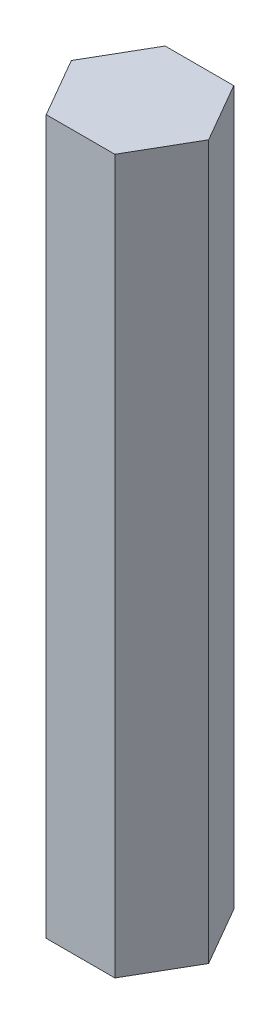
ISO-10303-21;
HEADER;
FILE_DESCRIPTION(('STEP AP214'),'2;1');
FILE_NAME('part.step','',(''),(''),'','','');
FILE_SCHEMA(('AUTOMOTIVE_DESIGN { 1 0 10303 214 1 1 1 1 }'));
ENDSEC;
DATA;
#1=APPLICATION_CONTEXT('core data for automotive mechanical design processes');
#2=APPLICATION_PROTOCOL_DEFINITION('international standard','automotive_design',2000,#1);
#3=PRODUCT_CONTEXT('',#1,'mechanical');
#4=PRODUCT('Part','Part','',(#3));
#5=PRODUCT_RELATED_PRODUCT_CATEGORY('part','',(#4));
#6=PRODUCT_DEFINITION_FORMATION('','',#4);
#7=PRODUCT_DEFINITION_CONTEXT('part definition',#1,'design');
#8=PRODUCT_DEFINITION('design','',#6,#7);
#9=PRODUCT_DEFINITION_SHAPE('','',#8);
#10=(LENGTH_UNIT() NAMED_UNIT(*) SI_UNIT(.MILLI.,.METRE.));
#11=(NAMED_UNIT(*) PLANE_ANGLE_UNIT() SI_UNIT($,.RADIAN.));
#12=(NAMED_UNIT(*) SI_UNIT($,.STERADIAN.) SOLID_ANGLE_UNIT());
#13=UNCERTAINTY_MEASURE_WITH_UNIT(LENGTH_MEASURE(1.E-05),#10,'distance_accuracy_value','');
#14=(GEOMETRIC_REPRESENTATION_CONTEXT(3) GLOBAL_UNCERTAINTY_ASSIGNED_CONTEXT((#13)) GLOBAL_UNIT_ASSIGNED_CONTEXT((#10,
#11,#12)) REPRESENTATION_CONTEXT('',''));
#15=CARTESIAN_POINT('',(0.,0.,0.));
#16=DIRECTION('',(0.,0.,1.));
#17=DIRECTION('',(1.,0.,0.));
#18=AXIS2_PLACEMENT_3D('',#15,#16,#17);
#19=CARTESIAN_POINT('',(7.33234841870825,38.1,0.));
#20=DIRECTION('',(-0.866025403784438,0.,0.5));
#21=DIRECTION('',(0.5,0.,0.866025403784438));
#22=AXIS2_PLACEMENT_3D('',#19,#20,#21);
#23=PLANE('',#22);
#24=DIRECTION('',(-0.5,0.,-0.866025403784438));
#25=VECTOR('',#24,1.);
#26=CARTESIAN_POINT('',(7.33234841870825,-38.1,0.));
#27=LINE('',#26,#25);
#28=CARTESIAN_POINT('',(7.33234841870825,-38.1,0.));
#29=VERTEX_POINT('',#28);
#30=CARTESIAN_POINT('',(3.66617420935413,-38.1,-6.35));
#31=VERTEX_POINT('',#30);
#32=EDGE_CURVE('E117',#29,#31,#27,.T.);
#33=ORIENTED_EDGE('',*,*,#32,.T.);
#34=DIRECTION('',(0.,-1.,0.));
#35=VECTOR('',#34,1.);
#36=CARTESIAN_POINT('',(3.66617420935413,38.1,-6.35));
#37=LINE('',#36,#35);
#38=CARTESIAN_POINT('',(3.66617420935413,38.1,-6.35));
#39=VERTEX_POINT('',#38);
#40=EDGE_CURVE('E11',#39,#31,#37,.T.);
#41=ORIENTED_EDGE('',*,*,#40,.F.);
#42=DIRECTION('',(-0.5,0.,-0.866025403784438));
#43=VECTOR('',#42,1.);
#44=CARTESIAN_POINT('',(7.33234841870825,38.1,0.));
#45=LINE('',#44,#43);
#46=CARTESIAN_POINT('',(7.33234841870825,38.1,0.));
#47=VERTEX_POINT('',#46);
#48=EDGE_CURVE('E127',#47,#39,#45,.T.);
#49=ORIENTED_EDGE('',*,*,#48,.F.);
#50=DIRECTION('',(0.,-1.,0.));
#51=VECTOR('',#50,1.);
#52=CARTESIAN_POINT('',(7.33234841870825,38.1,0.));
#53=LINE('',#52,#51);
#54=EDGE_CURVE('E113',#47,#29,#53,.T.);
#55=ORIENTED_EDGE('',*,*,#54,.T.);
#56=EDGE_LOOP('',(#33,#41,#49,#55));
#57=FACE_BOUND('',#56,.T.);
#58=ADVANCED_FACE('F33',(#57),#23,.F.);
#59=CARTESIAN_POINT('',(3.66617420935413,38.1,-6.35));
#60=DIRECTION('',(0.,0.,1.));
#61=DIRECTION('',(1.,0.,0.));
#62=AXIS2_PLACEMENT_3D('',#59,#60,#61);
#63=PLANE('',#62);
#64=DIRECTION('',(-1.,0.,0.));
#65=VECTOR('',#64,1.);
#66=CARTESIAN_POINT('',(3.66617420935413,-38.1,-6.35));
#67=LINE('',#66,#65);
#68=CARTESIAN_POINT('',(-3.66617420935412,-38.1,-6.35));
#69=VERTEX_POINT('',#68);
#70=EDGE_CURVE('E120',#31,#69,#67,.T.);
#71=ORIENTED_EDGE('',*,*,#70,.T.);
#72=DIRECTION('',(0.,-1.,0.));
#73=VECTOR('',#72,1.);
#74=CARTESIAN_POINT('',(-3.66617420935412,38.1,-6.35));
#75=LINE('',#74,#73);
#76=CARTESIAN_POINT('',(-3.66617420935412,38.1,-6.35));
#77=VERTEX_POINT('',#76);
#78=EDGE_CURVE('E41',#77,#69,#75,.T.);
#79=ORIENTED_EDGE('',*,*,#78,.F.);
#80=DIRECTION('',(-1.,0.,0.));
#81=VECTOR('',#80,1.);
#82=CARTESIAN_POINT('',(3.66617420935413,38.1,-6.35));
#83=LINE('',#82,#81);
#84=EDGE_CURVE('E86',#39,#77,#83,.T.);
#85=ORIENTED_EDGE('',*,*,#84,.F.);
#86=ORIENTED_EDGE('',*,*,#40,.T.);
#87=EDGE_LOOP('',(#71,#79,#85,#86));
#88=FACE_BOUND('',#87,.T.);
#89=ADVANCED_FACE('F151',(#88),#63,.F.);
#90=CARTESIAN_POINT('',(-3.66617420935412,38.1,-6.35));
#91=DIRECTION('',(0.866025403784439,0.,0.5));
#92=DIRECTION('',(0.5,0.,-0.866025403784439));
#93=AXIS2_PLACEMENT_3D('',#90,#91,#92);
#94=PLANE('',#93);
#95=DIRECTION('',(-0.5,0.,0.866025403784439));
#96=VECTOR('',#95,1.);
#97=CARTESIAN_POINT('',(-3.66617420935412,-38.1,-6.35));
#98=LINE('',#97,#96);
#99=CARTESIAN_POINT('',(-7.33234841870824,-38.1,0.));
#100=VERTEX_POINT('',#99);
#101=EDGE_CURVE('E122',#69,#100,#98,.T.);
#102=ORIENTED_EDGE('',*,*,#101,.T.);
#103=DIRECTION('',(0.,-1.,0.));
#104=VECTOR('',#103,1.);
#105=CARTESIAN_POINT('',(-7.33234841870824,38.1,0.));
#106=LINE('',#105,#104);
#107=CARTESIAN_POINT('',(-7.33234841870824,38.1,0.));
#108=VERTEX_POINT('',#107);
#109=EDGE_CURVE('E108',#108,#100,#106,.T.);
#110=ORIENTED_EDGE('',*,*,#109,.F.);
#111=DIRECTION('',(-0.5,0.,0.866025403784439));
#112=VECTOR('',#111,1.);
#113=CARTESIAN_POINT('',(-3.66617420935412,38.1,-6.35));
#114=LINE('',#113,#112);
#115=EDGE_CURVE('E99',#77,#108,#114,.T.);
#116=ORIENTED_EDGE('',*,*,#115,.F.);
#117=ORIENTED_EDGE('',*,*,#78,.T.);
#118=EDGE_LOOP('',(#102,#110,#116,#117));
#119=FACE_BOUND('',#118,.T.);
#120=ADVANCED_FACE('F133',(#119),#94,.F.);
#121=CARTESIAN_POINT('',(-7.33234841870824,38.1,0.));
#122=DIRECTION('',(0.866025403784439,0.,-0.5));
#123=DIRECTION('',(-0.5,0.,-0.866025403784438));
#124=AXIS2_PLACEMENT_3D('',#121,#122,#123);
#125=PLANE('',#124);
#126=DIRECTION('',(0.5,0.,0.866025403784439));
#127=VECTOR('',#126,1.);
#128=CARTESIAN_POINT('',(-7.33234841870824,-38.1,0.));
#129=LINE('',#128,#127);
#130=CARTESIAN_POINT('',(-3.66617420935412,-38.1,6.35));
#131=VERTEX_POINT('',#130);
#132=EDGE_CURVE('E107',#100,#131,#129,.T.);
#133=ORIENTED_EDGE('',*,*,#132,.T.);
#134=DIRECTION('',(0.,-1.,0.));
#135=VECTOR('',#134,1.);
#136=CARTESIAN_POINT('',(-3.66617420935412,38.1,6.35));
#137=LINE('',#136,#135);
#138=CARTESIAN_POINT('',(-3.66617420935412,38.1,6.35));
#139=VERTEX_POINT('',#138);
#140=EDGE_CURVE('E104',#139,#131,#137,.T.);
#141=ORIENTED_EDGE('',*,*,#140,.F.);
#142=DIRECTION('',(0.5,0.,0.866025403784439));
#143=VECTOR('',#142,1.);
#144=CARTESIAN_POINT('',(-7.33234841870824,38.1,0.));
#145=LINE('',#144,#143);
#146=EDGE_CURVE('E93',#108,#139,#145,.T.);
#147=ORIENTED_EDGE('',*,*,#146,.F.);
#148=ORIENTED_EDGE('',*,*,#109,.T.);
#149=EDGE_LOOP('',(#133,#141,#147,#148));
#150=FACE_BOUND('',#149,.T.);
#151=ADVANCED_FACE('F105',(#150),#125,.F.);
#152=CARTESIAN_POINT('',(-3.66617420935412,38.1,6.35));
#153=DIRECTION('',(0.,0.,-1.));
#154=DIRECTION('',(-1.,0.,0.));
#155=AXIS2_PLACEMENT_3D('',#152,#153,#154);
#156=PLANE('',#155);
#157=DIRECTION('',(1.,0.,0.));
#158=VECTOR('',#157,1.);
#159=CARTESIAN_POINT('',(-3.66617420935412,-38.1,6.35));
#160=LINE('',#159,#158);
#161=CARTESIAN_POINT('',(3.66617420935413,-38.1,6.35));
#162=VERTEX_POINT('',#161);
#163=EDGE_CURVE('E72',#131,#162,#160,.T.);
#164=ORIENTED_EDGE('',*,*,#163,.T.);
#165=DIRECTION('',(0.,-1.,0.));
#166=VECTOR('',#165,1.);
#167=CARTESIAN_POINT('',(3.66617420935413,38.1,6.35));
#168=LINE('',#167,#166);
#169=CARTESIAN_POINT('',(3.66617420935413,38.1,6.35));
#170=VERTEX_POINT('',#169);
#171=EDGE_CURVE('E109',#170,#162,#168,.T.);
#172=ORIENTED_EDGE('',*,*,#171,.F.);
#173=DIRECTION('',(1.,0.,0.));
#174=VECTOR('',#173,1.);
#175=CARTESIAN_POINT('',(-3.66617420935412,38.1,6.35));
#176=LINE('',#175,#174);
#177=EDGE_CURVE('E97',#139,#170,#176,.T.);
#178=ORIENTED_EDGE('',*,*,#177,.F.);
#179=ORIENTED_EDGE('',*,*,#140,.T.);
#180=EDGE_LOOP('',(#164,#172,#178,#179));
#181=FACE_BOUND('',#180,.T.);
#182=ADVANCED_FACE('F111',(#181),#156,.F.);
#183=CARTESIAN_POINT('',(3.66617420935413,38.1,6.35));
#184=DIRECTION('',(-0.866025403784439,0.,-0.5));
#185=DIRECTION('',(-0.5,0.,0.866025403784439));
#186=AXIS2_PLACEMENT_3D('',#183,#184,#185);
#187=PLANE('',#186);
#188=DIRECTION('',(0.5,0.,-0.866025403784439));
#189=VECTOR('',#188,1.);
#190=CARTESIAN_POINT('',(3.66617420935413,-38.1,6.35));
#191=LINE('',#190,#189);
#192=EDGE_CURVE('E78',#162,#29,#191,.T.);
#193=ORIENTED_EDGE('',*,*,#192,.T.);
#194=ORIENTED_EDGE('',*,*,#54,.F.);
#195=DIRECTION('',(0.5,0.,-0.866025403784439));
#196=VECTOR('',#195,1.);
#197=CARTESIAN_POINT('',(3.66617420935413,38.1,6.35));
#198=LINE('',#197,#196);
#199=EDGE_CURVE('E49',#170,#47,#198,.T.);
#200=ORIENTED_EDGE('',*,*,#199,.F.);
#201=ORIENTED_EDGE('',*,*,#171,.T.);
#202=EDGE_LOOP('',(#193,#194,#200,#201));
#203=FACE_BOUND('',#202,.T.);
#204=ADVANCED_FACE('F140',(#203),#187,.F.);
#205=CARTESIAN_POINT('',(0.,38.1,0.));
#206=DIRECTION('',(0.,1.,0.));
#207=DIRECTION('',(0.,0.,1.));
#208=AXIS2_PLACEMENT_3D('',#205,#206,#207);
#209=PLANE('',#208);
#210=ORIENTED_EDGE('',*,*,#48,.T.);
#211=ORIENTED_EDGE('',*,*,#84,.T.);
#212=ORIENTED_EDGE('',*,*,#115,.T.);
#213=ORIENTED_EDGE('',*,*,#146,.T.);
#214=ORIENTED_EDGE('',*,*,#177,.T.);
#215=ORIENTED_EDGE('',*,*,#199,.T.);
#216=EDGE_LOOP('',(#210,#211,#212,#213,#214,#215));
#217=FACE_BOUND('',#216,.T.);
#218=ADVANCED_FACE('F95',(#217),#209,.T.);
#219=CARTESIAN_POINT('',(0.,-38.1,0.));
#220=DIRECTION('',(0.,1.,0.));
#221=DIRECTION('',(0.,0.,1.));
#222=AXIS2_PLACEMENT_3D('',#219,#220,#221);
#223=PLANE('',#222);
#224=ORIENTED_EDGE('',*,*,#32,.F.);
#225=ORIENTED_EDGE('',*,*,#192,.F.);
#226=ORIENTED_EDGE('',*,*,#163,.F.);
#227=ORIENTED_EDGE('',*,*,#132,.F.);
#228=ORIENTED_EDGE('',*,*,#101,.F.);
#229=ORIENTED_EDGE('',*,*,#70,.F.);
#230=EDGE_LOOP('',(#224,#225,#226,#227,#228,#229));
#231=FACE_BOUND('',#230,.T.);
#232=ADVANCED_FACE('F136',(#231),#223,.F.);
#233=CLOSED_SHELL('',(#58,#89,#120,#151,#182,#204,#218,#232));
#234=MANIFOLD_SOLID_BREP('B2',#233);
#235=ADVANCED_BREP_SHAPE_REPRESENTATION('',(#18,#234),#14);
#236=SHAPE_DEFINITION_REPRESENTATION(#9,#235);
ENDSEC;
END-ISO-10303-21;
